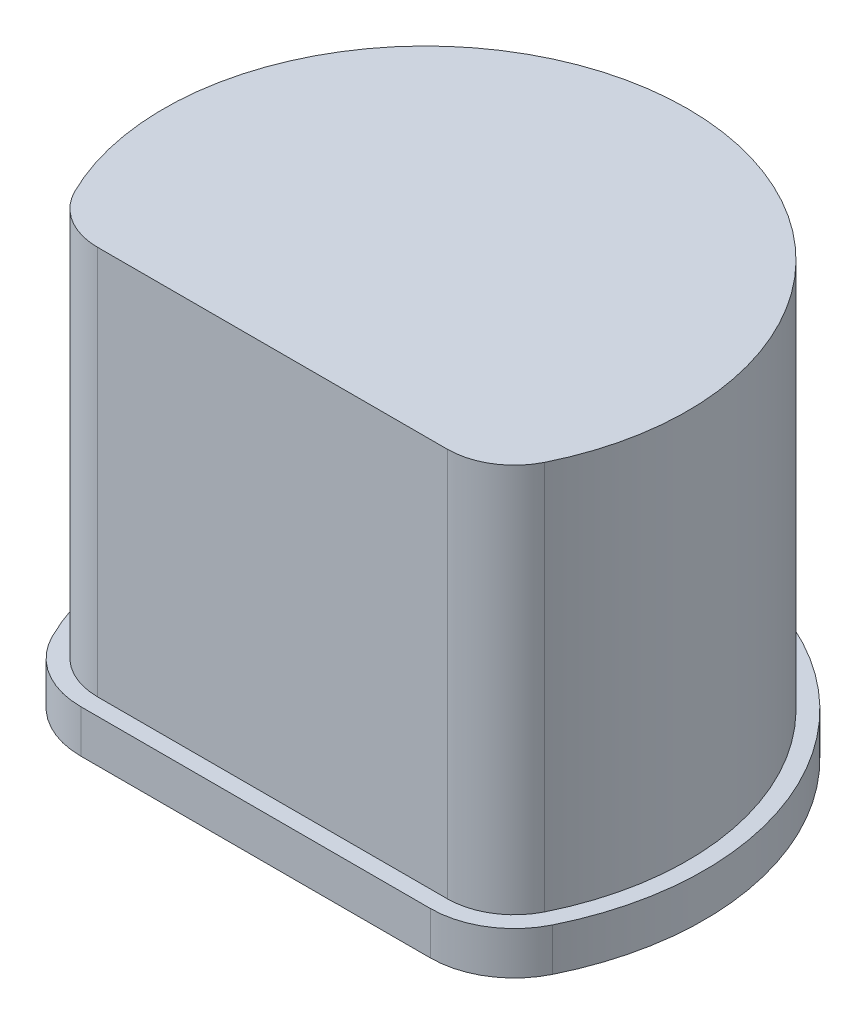
ISO-10303-21;
HEADER;
FILE_DESCRIPTION(('STEP AP214'),'2;1');
FILE_NAME('part.step','',(''),(''),'','','');
FILE_SCHEMA(('AUTOMOTIVE_DESIGN { 1 0 10303 214 1 1 1 1 }'));
ENDSEC;
DATA;
#1=APPLICATION_CONTEXT('core data for automotive mechanical design processes');
#2=APPLICATION_PROTOCOL_DEFINITION('international standard','automotive_design',2000,#1);
#3=PRODUCT_CONTEXT('',#1,'mechanical');
#4=PRODUCT('Part','Part','',(#3));
#5=PRODUCT_RELATED_PRODUCT_CATEGORY('part','',(#4));
#6=PRODUCT_DEFINITION_FORMATION('','',#4);
#7=PRODUCT_DEFINITION_CONTEXT('part definition',#1,'design');
#8=PRODUCT_DEFINITION('design','',#6,#7);
#9=PRODUCT_DEFINITION_SHAPE('','',#8);
#10=(LENGTH_UNIT() NAMED_UNIT(*) SI_UNIT(.MILLI.,.METRE.));
#11=(NAMED_UNIT(*) PLANE_ANGLE_UNIT() SI_UNIT($,.RADIAN.));
#12=(NAMED_UNIT(*) SI_UNIT($,.STERADIAN.) SOLID_ANGLE_UNIT());
#13=UNCERTAINTY_MEASURE_WITH_UNIT(LENGTH_MEASURE(1.E-05),#10,'distance_accuracy_value','');
#14=(GEOMETRIC_REPRESENTATION_CONTEXT(3) GLOBAL_UNCERTAINTY_ASSIGNED_CONTEXT((#13)) GLOBAL_UNIT_ASSIGNED_CONTEXT((#10,
#11,#12)) REPRESENTATION_CONTEXT('',''));
#15=CARTESIAN_POINT('',(0.,0.,0.));
#16=DIRECTION('',(0.,0.,1.));
#17=DIRECTION('',(1.,0.,0.));
#18=AXIS2_PLACEMENT_3D('',#15,#16,#17);
#19=CARTESIAN_POINT('',(6.52916533716215,-1.6,3.22000000000004));
#20=DIRECTION('',(0.,1.,0.));
#21=DIRECTION('',(0.,0.,1.));
#22=AXIS2_PLACEMENT_3D('',#19,#20,#21);
#23=PLANE('',#22);
#24=CARTESIAN_POINT('',(6.52916533716215,-1.6,3.22000000000004));
#25=DIRECTION('',(0.,-1.,0.));
#26=DIRECTION('',(0.,0.,1.));
#27=AXIS2_PLACEMENT_3D('',#24,#25,#26);
#28=CIRCLE('',#27,3.13);
#29=CARTESIAN_POINT('',(9.33634768679367,-1.6,4.60442307692315));
#30=VERTEX_POINT('',#29);
#31=CARTESIAN_POINT('',(6.52916533716213,-1.6,6.35000000000004));
#32=VERTEX_POINT('',#31);
#33=EDGE_CURVE('E153',#30,#32,#28,.T.);
#34=ORIENTED_EDGE('',*,*,#33,.T.);
#35=DIRECTION('',(-1.,0.,0.));
#36=VECTOR('',#35,1.);
#37=CARTESIAN_POINT('',(6.52916533716213,-1.6,6.35000000000004));
#38=LINE('',#37,#36);
#39=CARTESIAN_POINT('',(-6.52916533716221,-1.6,6.35000000000004));
#40=VERTEX_POINT('',#39);
#41=EDGE_CURVE('E156',#32,#40,#38,.T.);
#42=ORIENTED_EDGE('',*,*,#41,.T.);
#43=CARTESIAN_POINT('',(-6.52916533716219,-1.6,3.21999999999995));
#44=DIRECTION('',(0.,-1.,0.));
#45=DIRECTION('',(0.,0.,1.));
#46=AXIS2_PLACEMENT_3D('',#43,#44,#45);
#47=CIRCLE('',#46,3.13000000000004);
#48=CARTESIAN_POINT('',(-9.33634768679378,-1.6,4.60442307692303));
#49=VERTEX_POINT('',#48);
#50=EDGE_CURVE('E159',#40,#49,#47,.T.);
#51=ORIENTED_EDGE('',*,*,#50,.T.);
#52=CARTESIAN_POINT('',(0.,-1.6,0.));
#53=DIRECTION('',(0.,-1.,0.));
#54=DIRECTION('',(0.,0.,-1.));
#55=AXIS2_PLACEMENT_3D('',#52,#53,#54);
#56=CIRCLE('',#55,10.41);
#57=EDGE_CURVE('E161',#49,#30,#56,.T.);
#58=ORIENTED_EDGE('',*,*,#57,.T.);
#59=EDGE_LOOP('',(#34,#42,#51,#58));
#60=FACE_BOUND('',#59,.T.);
#61=DIRECTION('',(0.,0.,1.));
#62=VECTOR('',#61,1.);
#63=CARTESIAN_POINT('',(6.175,-1.6,-2.05));
#64=LINE('',#63,#62);
#65=CARTESIAN_POINT('',(6.175,-1.6,-2.05));
#66=VERTEX_POINT('',#65);
#67=CARTESIAN_POINT('',(6.175,-1.6,2.05));
#68=VERTEX_POINT('',#67);
#69=EDGE_CURVE('E143',#66,#68,#64,.T.);
#70=ORIENTED_EDGE('',*,*,#69,.F.);
#71=DIRECTION('',(1.,0.,0.));
#72=VECTOR('',#71,1.);
#73=CARTESIAN_POINT('',(6.175,-1.6,-2.05));
#74=LINE('',#73,#72);
#75=CARTESIAN_POINT('',(-6.175,-1.6,-2.05));
#76=VERTEX_POINT('',#75);
#77=EDGE_CURVE('E140',#76,#66,#74,.T.);
#78=ORIENTED_EDGE('',*,*,#77,.F.);
#79=DIRECTION('',(0.,0.,-1.));
#80=VECTOR('',#79,1.);
#81=CARTESIAN_POINT('',(-6.175,-1.6,-2.05));
#82=LINE('',#81,#80);
#83=CARTESIAN_POINT('',(-6.175,-1.6,2.05));
#84=VERTEX_POINT('',#83);
#85=EDGE_CURVE('E54',#84,#76,#82,.T.);
#86=ORIENTED_EDGE('',*,*,#85,.F.);
#87=DIRECTION('',(-1.,0.,0.));
#88=VECTOR('',#87,1.);
#89=CARTESIAN_POINT('',(6.175,-1.6,2.05));
#90=LINE('',#89,#88);
#91=EDGE_CURVE('E49',#68,#84,#90,.T.);
#92=ORIENTED_EDGE('',*,*,#91,.F.);
#93=EDGE_LOOP('',(#70,#78,#86,#92));
#94=FACE_BOUND('',#93,.T.);
#95=ADVANCED_FACE('F34',(#60,#94),#23,.F.);
#96=CARTESIAN_POINT('',(-6.52916533716217,14.54,3.22));
#97=DIRECTION('',(0.,-1.,0.));
#98=DIRECTION('',(0.,0.,-1.));
#99=AXIS2_PLACEMENT_3D('',#96,#97,#98);
#100=CYLINDRICAL_SURFACE('',#99,2.5);
#101=CARTESIAN_POINT('',(-6.52916533716217,0.,3.22));
#102=DIRECTION('',(0.,1.,0.));
#103=DIRECTION('',(0.,0.,-1.));
#104=AXIS2_PLACEMENT_3D('',#101,#102,#103);
#105=CIRCLE('',#104,2.5);
#106=CARTESIAN_POINT('',(-8.77132376338544,0.,4.32576923076923));
#107=VERTEX_POINT('',#106);
#108=CARTESIAN_POINT('',(-6.52916533716217,0.,5.72));
#109=VERTEX_POINT('',#108);
#110=EDGE_CURVE('E179',#107,#109,#105,.T.);
#111=ORIENTED_EDGE('',*,*,#110,.T.);
#112=DIRECTION('',(0.,-1.,0.));
#113=VECTOR('',#112,1.);
#114=CARTESIAN_POINT('',(-6.52916533716217,14.54,5.72));
#115=LINE('',#114,#113);
#116=CARTESIAN_POINT('',(-6.52916533716217,14.54,5.72));
#117=VERTEX_POINT('',#116);
#118=EDGE_CURVE('E11',#117,#109,#115,.T.);
#119=ORIENTED_EDGE('',*,*,#118,.F.);
#120=CARTESIAN_POINT('',(-6.52916533716217,14.54,3.22));
#121=DIRECTION('',(0.,1.,0.));
#122=DIRECTION('',(0.,0.,-1.));
#123=AXIS2_PLACEMENT_3D('',#120,#121,#122);
#124=CIRCLE('',#123,2.5);
#125=CARTESIAN_POINT('',(-8.77132376338544,14.54,4.32576923076923));
#126=VERTEX_POINT('',#125);
#127=EDGE_CURVE('E180',#126,#117,#124,.T.);
#128=ORIENTED_EDGE('',*,*,#127,.F.);
#129=DIRECTION('',(0.,-1.,0.));
#130=VECTOR('',#129,1.);
#131=CARTESIAN_POINT('',(-8.77132376338544,14.54,4.32576923076923));
#132=LINE('',#131,#130);
#133=EDGE_CURVE('E190',#126,#107,#132,.T.);
#134=ORIENTED_EDGE('',*,*,#133,.T.);
#135=EDGE_LOOP('',(#111,#119,#128,#134));
#136=FACE_BOUND('',#135,.T.);
#137=ADVANCED_FACE('F36',(#136),#100,.T.);
#138=CARTESIAN_POINT('',(-6.52916533716217,14.54,5.72));
#139=DIRECTION('',(0.,0.,-1.));
#140=DIRECTION('',(-1.,0.,0.));
#141=AXIS2_PLACEMENT_3D('',#138,#139,#140);
#142=PLANE('',#141);
#143=DIRECTION('',(1.,0.,0.));
#144=VECTOR('',#143,1.);
#145=CARTESIAN_POINT('',(-6.52916533716217,0.,5.72));
#146=LINE('',#145,#144);
#147=CARTESIAN_POINT('',(6.52916533716217,0.,5.72));
#148=VERTEX_POINT('',#147);
#149=EDGE_CURVE('E193',#109,#148,#146,.T.);
#150=ORIENTED_EDGE('',*,*,#149,.T.);
#151=DIRECTION('',(0.,-1.,0.));
#152=VECTOR('',#151,1.);
#153=CARTESIAN_POINT('',(6.52916533716217,14.54,5.72));
#154=LINE('',#153,#152);
#155=CARTESIAN_POINT('',(6.52916533716217,14.54,5.72));
#156=VERTEX_POINT('',#155);
#157=EDGE_CURVE('E42',#156,#148,#154,.T.);
#158=ORIENTED_EDGE('',*,*,#157,.F.);
#159=DIRECTION('',(1.,0.,0.));
#160=VECTOR('',#159,1.);
#161=CARTESIAN_POINT('',(-6.52916533716217,14.54,5.72));
#162=LINE('',#161,#160);
#163=EDGE_CURVE('E183',#117,#156,#162,.T.);
#164=ORIENTED_EDGE('',*,*,#163,.F.);
#165=ORIENTED_EDGE('',*,*,#118,.T.);
#166=EDGE_LOOP('',(#150,#158,#164,#165));
#167=FACE_BOUND('',#166,.T.);
#168=ADVANCED_FACE('F212',(#167),#142,.F.);
#169=CARTESIAN_POINT('',(6.52916533716217,14.54,3.22));
#170=DIRECTION('',(0.,-1.,0.));
#171=DIRECTION('',(0.,0.,-1.));
#172=AXIS2_PLACEMENT_3D('',#169,#170,#171);
#173=CYLINDRICAL_SURFACE('',#172,2.5);
#174=CARTESIAN_POINT('',(6.52916533716217,0.,3.22));
#175=DIRECTION('',(0.,1.,0.));
#176=DIRECTION('',(0.,0.,-1.));
#177=AXIS2_PLACEMENT_3D('',#174,#175,#176);
#178=CIRCLE('',#177,2.5);
#179=CARTESIAN_POINT('',(8.77132376338544,0.,4.32576923076923));
#180=VERTEX_POINT('',#179);
#181=EDGE_CURVE('E196',#148,#180,#178,.T.);
#182=ORIENTED_EDGE('',*,*,#181,.T.);
#183=DIRECTION('',(0.,-1.,0.));
#184=VECTOR('',#183,1.);
#185=CARTESIAN_POINT('',(8.77132376338544,14.54,4.32576923076923));
#186=LINE('',#185,#184);
#187=CARTESIAN_POINT('',(8.77132376338544,14.54,4.32576923076923));
#188=VERTEX_POINT('',#187);
#189=EDGE_CURVE('E203',#188,#180,#186,.T.);
#190=ORIENTED_EDGE('',*,*,#189,.F.);
#191=CARTESIAN_POINT('',(6.52916533716217,14.54,3.22));
#192=DIRECTION('',(0.,1.,0.));
#193=DIRECTION('',(0.,0.,-1.));
#194=AXIS2_PLACEMENT_3D('',#191,#192,#193);
#195=CIRCLE('',#194,2.5);
#196=EDGE_CURVE('E186',#156,#188,#195,.T.);
#197=ORIENTED_EDGE('',*,*,#196,.F.);
#198=ORIENTED_EDGE('',*,*,#157,.T.);
#199=EDGE_LOOP('',(#182,#190,#197,#198));
#200=FACE_BOUND('',#199,.T.);
#201=ADVANCED_FACE('F209',(#200),#173,.T.);
#202=CARTESIAN_POINT('',(0.,14.54,0.));
#203=DIRECTION('',(0.,-1.,0.));
#204=DIRECTION('',(0.,0.,-1.));
#205=AXIS2_PLACEMENT_3D('',#202,#203,#204);
#206=CYLINDRICAL_SURFACE('',#205,9.78);
#207=CARTESIAN_POINT('',(0.,0.,0.));
#208=DIRECTION('',(0.,1.,0.));
#209=DIRECTION('',(0.,0.,1.));
#210=AXIS2_PLACEMENT_3D('',#207,#208,#209);
#211=CIRCLE('',#210,9.78);
#212=EDGE_CURVE('E184',#180,#107,#211,.T.);
#213=ORIENTED_EDGE('',*,*,#212,.T.);
#214=ORIENTED_EDGE('',*,*,#133,.F.);
#215=CARTESIAN_POINT('',(0.,14.54,0.));
#216=DIRECTION('',(0.,1.,0.));
#217=DIRECTION('',(0.,0.,1.));
#218=AXIS2_PLACEMENT_3D('',#215,#216,#217);
#219=CIRCLE('',#218,9.78);
#220=EDGE_CURVE('E188',#188,#126,#219,.T.);
#221=ORIENTED_EDGE('',*,*,#220,.F.);
#222=ORIENTED_EDGE('',*,*,#189,.T.);
#223=EDGE_LOOP('',(#213,#214,#221,#222));
#224=FACE_BOUND('',#223,.T.);
#225=ADVANCED_FACE('F218',(#224),#206,.T.);
#226=CARTESIAN_POINT('',(-6.52916533716217,14.54,3.22));
#227=DIRECTION('',(0.,-1.,0.));
#228=DIRECTION('',(0.,0.,-1.));
#229=AXIS2_PLACEMENT_3D('',#226,#227,#228);
#230=PLANE('',#229);
#231=ORIENTED_EDGE('',*,*,#127,.T.);
#232=ORIENTED_EDGE('',*,*,#163,.T.);
#233=ORIENTED_EDGE('',*,*,#196,.T.);
#234=ORIENTED_EDGE('',*,*,#220,.T.);
#235=EDGE_LOOP('',(#231,#232,#233,#234));
#236=FACE_BOUND('',#235,.T.);
#237=ADVANCED_FACE('F223',(#236),#230,.F.);
#238=CARTESIAN_POINT('',(6.52916533716215,0.,3.22000000000004));
#239=DIRECTION('',(0.,1.,0.));
#240=DIRECTION('',(0.,0.,1.));
#241=AXIS2_PLACEMENT_3D('',#238,#239,#240);
#242=PLANE('',#241);
#243=CARTESIAN_POINT('',(6.52916533716215,0.,3.22000000000004));
#244=DIRECTION('',(0.,-1.,0.));
#245=DIRECTION('',(0.,0.,1.));
#246=AXIS2_PLACEMENT_3D('',#243,#244,#245);
#247=CIRCLE('',#246,3.13);
#248=CARTESIAN_POINT('',(9.33634768679367,0.,4.60442307692315));
#249=VERTEX_POINT('',#248);
#250=CARTESIAN_POINT('',(6.52916533716213,0.,6.35000000000004));
#251=VERTEX_POINT('',#250);
#252=EDGE_CURVE('E144',#249,#251,#247,.T.);
#253=ORIENTED_EDGE('',*,*,#252,.F.);
#254=CARTESIAN_POINT('',(0.,0.,0.));
#255=DIRECTION('',(0.,-1.,0.));
#256=DIRECTION('',(0.,0.,-1.));
#257=AXIS2_PLACEMENT_3D('',#254,#255,#256);
#258=CIRCLE('',#257,10.41);
#259=CARTESIAN_POINT('',(-9.33634768679378,0.,4.60442307692303));
#260=VERTEX_POINT('',#259);
#261=EDGE_CURVE('E157',#260,#249,#258,.T.);
#262=ORIENTED_EDGE('',*,*,#261,.F.);
#263=CARTESIAN_POINT('',(-6.52916533716219,0.,3.21999999999995));
#264=DIRECTION('',(0.,-1.,0.));
#265=DIRECTION('',(0.,0.,1.));
#266=AXIS2_PLACEMENT_3D('',#263,#264,#265);
#267=CIRCLE('',#266,3.13000000000004);
#268=CARTESIAN_POINT('',(-6.52916533716221,0.,6.35000000000004));
#269=VERTEX_POINT('',#268);
#270=EDGE_CURVE('E165',#269,#260,#267,.T.);
#271=ORIENTED_EDGE('',*,*,#270,.F.);
#272=DIRECTION('',(-1.,0.,0.));
#273=VECTOR('',#272,1.);
#274=CARTESIAN_POINT('',(6.52916533716213,0.,6.35000000000004));
#275=LINE('',#274,#273);
#276=EDGE_CURVE('E147',#251,#269,#275,.T.);
#277=ORIENTED_EDGE('',*,*,#276,.F.);
#278=EDGE_LOOP('',(#253,#262,#271,#277));
#279=FACE_BOUND('',#278,.T.);
#280=ORIENTED_EDGE('',*,*,#110,.F.);
#281=ORIENTED_EDGE('',*,*,#212,.F.);
#282=ORIENTED_EDGE('',*,*,#181,.F.);
#283=ORIENTED_EDGE('',*,*,#149,.F.);
#284=EDGE_LOOP('',(#280,#281,#282,#283));
#285=FACE_BOUND('',#284,.T.);
#286=ADVANCED_FACE('F215',(#279,#285),#242,.T.);
#287=CARTESIAN_POINT('',(6.52916533716215,-1.6,3.22000000000004));
#288=DIRECTION('',(0.,1.,0.));
#289=DIRECTION('',(0.,0.,1.));
#290=AXIS2_PLACEMENT_3D('',#287,#288,#289);
#291=CYLINDRICAL_SURFACE('',#290,3.13);
#292=ORIENTED_EDGE('',*,*,#252,.T.);
#293=DIRECTION('',(0.,1.,0.));
#294=VECTOR('',#293,1.);
#295=CARTESIAN_POINT('',(6.52916533716213,-1.6,6.35000000000004));
#296=LINE('',#295,#294);
#297=EDGE_CURVE('E176',#32,#251,#296,.T.);
#298=ORIENTED_EDGE('',*,*,#297,.F.);
#299=ORIENTED_EDGE('',*,*,#33,.F.);
#300=DIRECTION('',(0.,1.,0.));
#301=VECTOR('',#300,1.);
#302=CARTESIAN_POINT('',(9.33634768679367,-1.6,4.60442307692315));
#303=LINE('',#302,#301);
#304=EDGE_CURVE('E162',#30,#249,#303,.T.);
#305=ORIENTED_EDGE('',*,*,#304,.T.);
#306=EDGE_LOOP('',(#292,#298,#299,#305));
#307=FACE_BOUND('',#306,.T.);
#308=ADVANCED_FACE('F230',(#307),#291,.T.);
#309=CARTESIAN_POINT('',(6.52916533716213,-1.6,6.35000000000004));
#310=DIRECTION('',(0.,0.,-1.));
#311=DIRECTION('',(-1.,0.,0.));
#312=AXIS2_PLACEMENT_3D('',#309,#310,#311);
#313=PLANE('',#312);
#314=ORIENTED_EDGE('',*,*,#276,.T.);
#315=DIRECTION('',(0.,1.,0.));
#316=VECTOR('',#315,1.);
#317=CARTESIAN_POINT('',(-6.52916533716221,-1.6,6.35000000000004));
#318=LINE('',#317,#316);
#319=EDGE_CURVE('E173',#40,#269,#318,.T.);
#320=ORIENTED_EDGE('',*,*,#319,.F.);
#321=ORIENTED_EDGE('',*,*,#41,.F.);
#322=ORIENTED_EDGE('',*,*,#297,.T.);
#323=EDGE_LOOP('',(#314,#320,#321,#322));
#324=FACE_BOUND('',#323,.T.);
#325=ADVANCED_FACE('F251',(#324),#313,.F.);
#326=CARTESIAN_POINT('',(-6.52916533716219,-1.6,3.21999999999995));
#327=DIRECTION('',(0.,1.,0.));
#328=DIRECTION('',(0.,0.,1.));
#329=AXIS2_PLACEMENT_3D('',#326,#327,#328);
#330=CYLINDRICAL_SURFACE('',#329,3.13000000000004);
#331=ORIENTED_EDGE('',*,*,#270,.T.);
#332=DIRECTION('',(0.,1.,0.));
#333=VECTOR('',#332,1.);
#334=CARTESIAN_POINT('',(-9.33634768679378,-1.6,4.60442307692303));
#335=LINE('',#334,#333);
#336=EDGE_CURVE('E170',#49,#260,#335,.T.);
#337=ORIENTED_EDGE('',*,*,#336,.F.);
#338=ORIENTED_EDGE('',*,*,#50,.F.);
#339=ORIENTED_EDGE('',*,*,#319,.T.);
#340=EDGE_LOOP('',(#331,#337,#338,#339));
#341=FACE_BOUND('',#340,.T.);
#342=ADVANCED_FACE('F247',(#341),#330,.T.);
#343=CARTESIAN_POINT('',(0.,-1.6,0.));
#344=DIRECTION('',(0.,1.,0.));
#345=DIRECTION('',(0.,0.,1.));
#346=AXIS2_PLACEMENT_3D('',#343,#344,#345);
#347=CYLINDRICAL_SURFACE('',#346,10.41);
#348=ORIENTED_EDGE('',*,*,#261,.T.);
#349=ORIENTED_EDGE('',*,*,#304,.F.);
#350=ORIENTED_EDGE('',*,*,#57,.F.);
#351=ORIENTED_EDGE('',*,*,#336,.T.);
#352=EDGE_LOOP('',(#348,#349,#350,#351));
#353=FACE_BOUND('',#352,.T.);
#354=ADVANCED_FACE('F244',(#353),#347,.T.);
#355=CARTESIAN_POINT('',(6.175,-4.05,-2.05));
#356=DIRECTION('',(-1.,0.,0.));
#357=DIRECTION('',(0.,0.,1.));
#358=AXIS2_PLACEMENT_3D('',#355,#356,#357);
#359=PLANE('',#358);
#360=ORIENTED_EDGE('',*,*,#69,.T.);
#361=DIRECTION('',(0.,1.,0.));
#362=VECTOR('',#361,1.);
#363=CARTESIAN_POINT('',(6.175,-4.05,2.05));
#364=LINE('',#363,#362);
#365=CARTESIAN_POINT('',(6.175,-4.05,2.05));
#366=VERTEX_POINT('',#365);
#367=EDGE_CURVE('E124',#366,#68,#364,.T.);
#368=ORIENTED_EDGE('',*,*,#367,.F.);
#369=DIRECTION('',(0.,0.,1.));
#370=VECTOR('',#369,1.);
#371=CARTESIAN_POINT('',(6.175,-4.05,-2.05));
#372=LINE('',#371,#370);
#373=CARTESIAN_POINT('',(6.175,-4.05,-2.05));
#374=VERTEX_POINT('',#373);
#375=EDGE_CURVE('E131',#374,#366,#372,.T.);
#376=ORIENTED_EDGE('',*,*,#375,.F.);
#377=DIRECTION('',(0.,1.,0.));
#378=VECTOR('',#377,1.);
#379=CARTESIAN_POINT('',(6.175,-4.05,-2.05));
#380=LINE('',#379,#378);
#381=EDGE_CURVE('E376',#374,#66,#380,.T.);
#382=ORIENTED_EDGE('',*,*,#381,.T.);
#383=EDGE_LOOP('',(#360,#368,#376,#382));
#384=FACE_BOUND('',#383,.T.);
#385=ADVANCED_FACE('F142',(#384),#359,.F.);
#386=CARTESIAN_POINT('',(6.175,-4.05,2.05));
#387=DIRECTION('',(0.,0.,-1.));
#388=DIRECTION('',(-1.,0.,0.));
#389=AXIS2_PLACEMENT_3D('',#386,#387,#388);
#390=PLANE('',#389);
#391=ORIENTED_EDGE('',*,*,#91,.T.);
#392=DIRECTION('',(0.,1.,0.));
#393=VECTOR('',#392,1.);
#394=CARTESIAN_POINT('',(-6.175,-4.05,2.05));
#395=LINE('',#394,#393);
#396=CARTESIAN_POINT('',(-6.175,-4.05,2.05));
#397=VERTEX_POINT('',#396);
#398=EDGE_CURVE('E127',#397,#84,#395,.T.);
#399=ORIENTED_EDGE('',*,*,#398,.F.);
#400=DIRECTION('',(-1.,0.,0.));
#401=VECTOR('',#400,1.);
#402=CARTESIAN_POINT('',(6.175,-4.05,2.05));
#403=LINE('',#402,#401);
#404=EDGE_CURVE('E120',#366,#397,#403,.T.);
#405=ORIENTED_EDGE('',*,*,#404,.F.);
#406=ORIENTED_EDGE('',*,*,#367,.T.);
#407=EDGE_LOOP('',(#391,#399,#405,#406));
#408=FACE_BOUND('',#407,.T.);
#409=ADVANCED_FACE('F122',(#408),#390,.F.);
#410=CARTESIAN_POINT('',(-6.175,-4.05,-2.05));
#411=DIRECTION('',(1.,0.,0.));
#412=DIRECTION('',(0.,0.,-1.));
#413=AXIS2_PLACEMENT_3D('',#410,#411,#412);
#414=PLANE('',#413);
#415=ORIENTED_EDGE('',*,*,#85,.T.);
#416=DIRECTION('',(0.,1.,0.));
#417=VECTOR('',#416,1.);
#418=CARTESIAN_POINT('',(-6.175,-4.05,-2.05));
#419=LINE('',#418,#417);
#420=CARTESIAN_POINT('',(-6.175,-4.05,-2.05));
#421=VERTEX_POINT('',#420);
#422=EDGE_CURVE('E149',#421,#76,#419,.T.);
#423=ORIENTED_EDGE('',*,*,#422,.F.);
#424=DIRECTION('',(0.,0.,-1.));
#425=VECTOR('',#424,1.);
#426=CARTESIAN_POINT('',(-6.175,-4.05,-2.05));
#427=LINE('',#426,#425);
#428=EDGE_CURVE('E130',#397,#421,#427,.T.);
#429=ORIENTED_EDGE('',*,*,#428,.F.);
#430=ORIENTED_EDGE('',*,*,#398,.T.);
#431=EDGE_LOOP('',(#415,#423,#429,#430));
#432=FACE_BOUND('',#431,.T.);
#433=ADVANCED_FACE('F294',(#432),#414,.F.);
#434=CARTESIAN_POINT('',(6.175,-4.05,-2.05));
#435=DIRECTION('',(0.,0.,1.));
#436=DIRECTION('',(1.,0.,0.));
#437=AXIS2_PLACEMENT_3D('',#434,#435,#436);
#438=PLANE('',#437);
#439=ORIENTED_EDGE('',*,*,#77,.T.);
#440=ORIENTED_EDGE('',*,*,#381,.F.);
#441=DIRECTION('',(1.,0.,0.));
#442=VECTOR('',#441,1.);
#443=CARTESIAN_POINT('',(6.175,-4.05,-2.05));
#444=LINE('',#443,#442);
#445=EDGE_CURVE('E136',#421,#374,#444,.T.);
#446=ORIENTED_EDGE('',*,*,#445,.F.);
#447=ORIENTED_EDGE('',*,*,#422,.T.);
#448=EDGE_LOOP('',(#439,#440,#446,#447));
#449=FACE_BOUND('',#448,.T.);
#450=ADVANCED_FACE('F300',(#449),#438,.F.);
#451=CARTESIAN_POINT('',(0.,-4.05,0.));
#452=DIRECTION('',(0.,-1.,0.));
#453=DIRECTION('',(0.,0.,-1.));
#454=AXIS2_PLACEMENT_3D('',#451,#452,#453);
#455=PLANE('',#454);
#456=ORIENTED_EDGE('',*,*,#375,.T.);
#457=ORIENTED_EDGE('',*,*,#404,.T.);
#458=ORIENTED_EDGE('',*,*,#428,.T.);
#459=ORIENTED_EDGE('',*,*,#445,.T.);
#460=EDGE_LOOP('',(#456,#457,#458,#459));
#461=FACE_BOUND('',#460,.T.);
#462=ADVANCED_FACE('F134',(#461),#455,.T.);
#463=CLOSED_SHELL('',(#95,#137,#168,#201,#225,#237,#286,#308,#325,#342,#354,#385,#409,#433,#450,#462));
#464=MANIFOLD_SOLID_BREP('B2',#463);
#465=ADVANCED_BREP_SHAPE_REPRESENTATION('',(#18,#464),#14);
#466=SHAPE_DEFINITION_REPRESENTATION(#9,#465);
ENDSEC;
END-ISO-10303-21;
